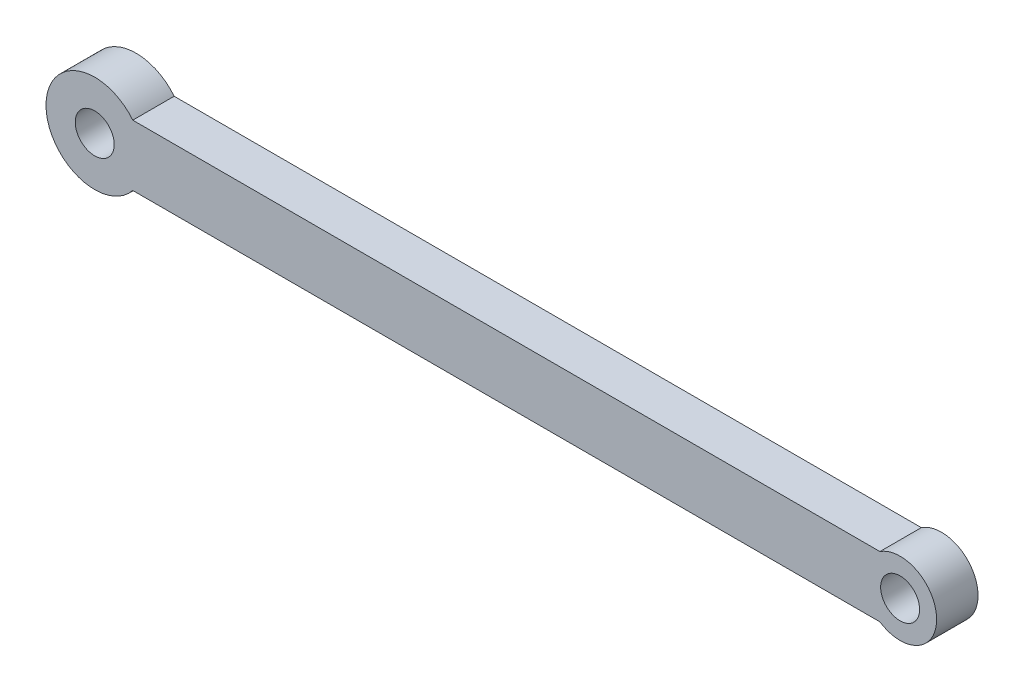
ISO-10303-21;
HEADER;
FILE_DESCRIPTION(('STEP AP214'),'2;1');
FILE_NAME('part.step','',(''),(''),'','','');
FILE_SCHEMA(('AUTOMOTIVE_DESIGN { 1 0 10303 214 1 1 1 1 }'));
ENDSEC;
DATA;
#1=APPLICATION_CONTEXT('core data for automotive mechanical design processes');
#2=APPLICATION_PROTOCOL_DEFINITION('international standard','automotive_design',2000,#1);
#3=PRODUCT_CONTEXT('',#1,'mechanical');
#4=PRODUCT('Part','Part','',(#3));
#5=PRODUCT_RELATED_PRODUCT_CATEGORY('part','',(#4));
#6=PRODUCT_DEFINITION_FORMATION('','',#4);
#7=PRODUCT_DEFINITION_CONTEXT('part definition',#1,'design');
#8=PRODUCT_DEFINITION('design','',#6,#7);
#9=PRODUCT_DEFINITION_SHAPE('','',#8);
#10=(LENGTH_UNIT() NAMED_UNIT(*) SI_UNIT(.MILLI.,.METRE.));
#11=(NAMED_UNIT(*) PLANE_ANGLE_UNIT() SI_UNIT($,.RADIAN.));
#12=(NAMED_UNIT(*) SI_UNIT($,.STERADIAN.) SOLID_ANGLE_UNIT());
#13=UNCERTAINTY_MEASURE_WITH_UNIT(LENGTH_MEASURE(1.E-05),#10,'distance_accuracy_value','');
#14=(GEOMETRIC_REPRESENTATION_CONTEXT(3) GLOBAL_UNCERTAINTY_ASSIGNED_CONTEXT((#13)) GLOBAL_UNIT_ASSIGNED_CONTEXT((#10,
#11,#12)) REPRESENTATION_CONTEXT('',''));
#15=CARTESIAN_POINT('',(0.,0.,0.));
#16=DIRECTION('',(0.,0.,1.));
#17=DIRECTION('',(1.,0.,0.));
#18=AXIS2_PLACEMENT_3D('',#15,#16,#17);
#19=CARTESIAN_POINT('',(0.,0.,3.4));
#20=DIRECTION('',(0.,0.,-1.));
#21=DIRECTION('',(-1.,0.,0.));
#22=AXIS2_PLACEMENT_3D('',#19,#20,#21);
#23=PLANE('',#22);
#24=CARTESIAN_POINT('',(0.,0.,3.4));
#25=DIRECTION('',(0.,0.,1.));
#26=DIRECTION('',(-1.,0.,0.));
#27=AXIS2_PLACEMENT_3D('',#24,#25,#26);
#28=CIRCLE('',#27,4.);
#29=CARTESIAN_POINT('',(3.1224989991992,2.5,3.4));
#30=VERTEX_POINT('',#29);
#31=CARTESIAN_POINT('',(3.1224989991992,-2.5,3.4));
#32=VERTEX_POINT('',#31);
#33=EDGE_CURVE('E85',#30,#32,#28,.T.);
#34=ORIENTED_EDGE('',*,*,#33,.T.);
#35=DIRECTION('',(1.,0.,0.));
#36=VECTOR('',#35,1.);
#37=CARTESIAN_POINT('',(3.1224989991992,-2.5,3.4));
#38=LINE('',#37,#36);
#39=CARTESIAN_POINT('',(64.4616876048223,-2.5,3.4));
#40=VERTEX_POINT('',#39);
#41=EDGE_CURVE('E80',#32,#40,#38,.T.);
#42=ORIENTED_EDGE('',*,*,#41,.T.);
#43=CARTESIAN_POINT('',(66.12,0.,3.4));
#44=DIRECTION('',(0.,0.,1.));
#45=DIRECTION('',(-1.,0.,0.));
#46=AXIS2_PLACEMENT_3D('',#43,#44,#45);
#47=CIRCLE('',#46,3.);
#48=CARTESIAN_POINT('',(64.4616876048223,2.5,3.4));
#49=VERTEX_POINT('',#48);
#50=EDGE_CURVE('E83',#40,#49,#47,.T.);
#51=ORIENTED_EDGE('',*,*,#50,.T.);
#52=DIRECTION('',(-1.,0.,0.));
#53=VECTOR('',#52,1.);
#54=CARTESIAN_POINT('',(3.1224989991992,2.5,3.4));
#55=LINE('',#54,#53);
#56=EDGE_CURVE('E50',#49,#30,#55,.T.);
#57=ORIENTED_EDGE('',*,*,#56,.T.);
#58=EDGE_LOOP('',(#34,#42,#51,#57));
#59=FACE_BOUND('',#58,.T.);
#60=CARTESIAN_POINT('',(0.,0.,3.4));
#61=DIRECTION('',(0.,0.,1.));
#62=DIRECTION('',(1.,0.,0.));
#63=AXIS2_PLACEMENT_3D('',#60,#61,#62);
#64=CIRCLE('',#63,1.6);
#65=CARTESIAN_POINT('',(1.6,0.,3.4));
#66=VERTEX_POINT('',#65);
#67=EDGE_CURVE('E100',#66,#66,#64,.T.);
#68=ORIENTED_EDGE('',*,*,#67,.F.);
#69=EDGE_LOOP('',(#68));
#70=FACE_BOUND('',#69,.T.);
#71=CARTESIAN_POINT('',(66.12,0.,3.4));
#72=DIRECTION('',(0.,0.,1.));
#73=DIRECTION('',(1.,0.,0.));
#74=AXIS2_PLACEMENT_3D('',#71,#72,#73);
#75=CIRCLE('',#74,1.60000000000001);
#76=CARTESIAN_POINT('',(67.72,0.,3.4));
#77=VERTEX_POINT('',#76);
#78=EDGE_CURVE('E115',#77,#77,#75,.T.);
#79=ORIENTED_EDGE('',*,*,#78,.F.);
#80=EDGE_LOOP('',(#79));
#81=FACE_BOUND('',#80,.T.);
#82=ADVANCED_FACE('F33',(#59,#70,#81),#23,.F.);
#83=CARTESIAN_POINT('',(0.,0.,0.));
#84=DIRECTION('',(0.,0.,-1.));
#85=DIRECTION('',(-1.,0.,0.));
#86=AXIS2_PLACEMENT_3D('',#83,#84,#85);
#87=PLANE('',#86);
#88=CARTESIAN_POINT('',(0.,0.,0.));
#89=DIRECTION('',(0.,0.,1.));
#90=DIRECTION('',(1.,0.,0.));
#91=AXIS2_PLACEMENT_3D('',#88,#89,#90);
#92=CIRCLE('',#91,1.6);
#93=CARTESIAN_POINT('',(1.6,0.,0.));
#94=VERTEX_POINT('',#93);
#95=EDGE_CURVE('E112',#94,#94,#92,.T.);
#96=ORIENTED_EDGE('',*,*,#95,.T.);
#97=EDGE_LOOP('',(#96));
#98=FACE_BOUND('',#97,.T.);
#99=CARTESIAN_POINT('',(0.,0.,0.));
#100=DIRECTION('',(0.,0.,1.));
#101=DIRECTION('',(-1.,0.,0.));
#102=AXIS2_PLACEMENT_3D('',#99,#100,#101);
#103=CIRCLE('',#102,4.);
#104=CARTESIAN_POINT('',(3.1224989991992,2.5,0.));
#105=VERTEX_POINT('',#104);
#106=CARTESIAN_POINT('',(3.1224989991992,-2.5,0.));
#107=VERTEX_POINT('',#106);
#108=EDGE_CURVE('E97',#105,#107,#103,.T.);
#109=ORIENTED_EDGE('',*,*,#108,.F.);
#110=DIRECTION('',(-1.,0.,0.));
#111=VECTOR('',#110,1.);
#112=CARTESIAN_POINT('',(3.1224989991992,2.5,0.));
#113=LINE('',#112,#111);
#114=CARTESIAN_POINT('',(64.4616876048223,2.5,0.));
#115=VERTEX_POINT('',#114);
#116=EDGE_CURVE('E73',#115,#105,#113,.T.);
#117=ORIENTED_EDGE('',*,*,#116,.F.);
#118=CARTESIAN_POINT('',(66.12,0.,0.));
#119=DIRECTION('',(0.,0.,1.));
#120=DIRECTION('',(-1.,0.,0.));
#121=AXIS2_PLACEMENT_3D('',#118,#119,#120);
#122=CIRCLE('',#121,3.);
#123=CARTESIAN_POINT('',(64.4616876048223,-2.5,0.));
#124=VERTEX_POINT('',#123);
#125=EDGE_CURVE('E67',#124,#115,#122,.T.);
#126=ORIENTED_EDGE('',*,*,#125,.F.);
#127=DIRECTION('',(1.,0.,0.));
#128=VECTOR('',#127,1.);
#129=CARTESIAN_POINT('',(3.1224989991992,-2.5,0.));
#130=LINE('',#129,#128);
#131=EDGE_CURVE('E89',#107,#124,#130,.T.);
#132=ORIENTED_EDGE('',*,*,#131,.F.);
#133=EDGE_LOOP('',(#109,#117,#126,#132));
#134=FACE_BOUND('',#133,.T.);
#135=CARTESIAN_POINT('',(66.12,0.,0.));
#136=DIRECTION('',(0.,0.,1.));
#137=DIRECTION('',(1.,0.,0.));
#138=AXIS2_PLACEMENT_3D('',#135,#136,#137);
#139=CIRCLE('',#138,1.60000000000001);
#140=CARTESIAN_POINT('',(67.72,0.,0.));
#141=VERTEX_POINT('',#140);
#142=EDGE_CURVE('E118',#141,#141,#139,.T.);
#143=ORIENTED_EDGE('',*,*,#142,.T.);
#144=EDGE_LOOP('',(#143));
#145=FACE_BOUND('',#144,.T.);
#146=ADVANCED_FACE('F108',(#98,#134,#145),#87,.T.);
#147=CARTESIAN_POINT('',(0.,0.,3.4));
#148=DIRECTION('',(0.,0.,-1.));
#149=DIRECTION('',(-1.,0.,0.));
#150=AXIS2_PLACEMENT_3D('',#147,#148,#149);
#151=CYLINDRICAL_SURFACE('',#150,4.);
#152=ORIENTED_EDGE('',*,*,#108,.T.);
#153=DIRECTION('',(0.,0.,-1.));
#154=VECTOR('',#153,1.);
#155=CARTESIAN_POINT('',(3.1224989991992,-2.5,3.4));
#156=LINE('',#155,#154);
#157=EDGE_CURVE('E11',#32,#107,#156,.T.);
#158=ORIENTED_EDGE('',*,*,#157,.F.);
#159=ORIENTED_EDGE('',*,*,#33,.F.);
#160=DIRECTION('',(0.,0.,-1.));
#161=VECTOR('',#160,1.);
#162=CARTESIAN_POINT('',(3.1224989991992,2.5,3.4));
#163=LINE('',#162,#161);
#164=EDGE_CURVE('E93',#30,#105,#163,.T.);
#165=ORIENTED_EDGE('',*,*,#164,.T.);
#166=EDGE_LOOP('',(#152,#158,#159,#165));
#167=FACE_BOUND('',#166,.T.);
#168=ADVANCED_FACE('F35',(#167),#151,.T.);
#169=CARTESIAN_POINT('',(3.1224989991992,-2.5,3.4));
#170=DIRECTION('',(0.,1.,0.));
#171=DIRECTION('',(0.,0.,1.));
#172=AXIS2_PLACEMENT_3D('',#169,#170,#171);
#173=PLANE('',#172);
#174=ORIENTED_EDGE('',*,*,#131,.T.);
#175=DIRECTION('',(0.,0.,-1.));
#176=VECTOR('',#175,1.);
#177=CARTESIAN_POINT('',(64.4616876048223,-2.5,3.4));
#178=LINE('',#177,#176);
#179=EDGE_CURVE('E42',#40,#124,#178,.T.);
#180=ORIENTED_EDGE('',*,*,#179,.F.);
#181=ORIENTED_EDGE('',*,*,#41,.F.);
#182=ORIENTED_EDGE('',*,*,#157,.T.);
#183=EDGE_LOOP('',(#174,#180,#181,#182));
#184=FACE_BOUND('',#183,.T.);
#185=ADVANCED_FACE('F88',(#184),#173,.F.);
#186=CARTESIAN_POINT('',(66.12,0.,3.4));
#187=DIRECTION('',(0.,0.,-1.));
#188=DIRECTION('',(-1.,0.,0.));
#189=AXIS2_PLACEMENT_3D('',#186,#187,#188);
#190=CYLINDRICAL_SURFACE('',#189,3.);
#191=ORIENTED_EDGE('',*,*,#125,.T.);
#192=DIRECTION('',(0.,0.,-1.));
#193=VECTOR('',#192,1.);
#194=CARTESIAN_POINT('',(64.4616876048223,2.5,3.4));
#195=LINE('',#194,#193);
#196=EDGE_CURVE('E90',#49,#115,#195,.T.);
#197=ORIENTED_EDGE('',*,*,#196,.F.);
#198=ORIENTED_EDGE('',*,*,#50,.F.);
#199=ORIENTED_EDGE('',*,*,#179,.T.);
#200=EDGE_LOOP('',(#191,#197,#198,#199));
#201=FACE_BOUND('',#200,.T.);
#202=ADVANCED_FACE('F91',(#201),#190,.T.);
#203=CARTESIAN_POINT('',(3.1224989991992,2.5,3.4));
#204=DIRECTION('',(0.,-1.,0.));
#205=DIRECTION('',(0.,0.,-1.));
#206=AXIS2_PLACEMENT_3D('',#203,#204,#205);
#207=PLANE('',#206);
#208=ORIENTED_EDGE('',*,*,#116,.T.);
#209=ORIENTED_EDGE('',*,*,#164,.F.);
#210=ORIENTED_EDGE('',*,*,#56,.F.);
#211=ORIENTED_EDGE('',*,*,#196,.T.);
#212=EDGE_LOOP('',(#208,#209,#210,#211));
#213=FACE_BOUND('',#212,.T.);
#214=ADVANCED_FACE('F105',(#213),#207,.F.);
#215=CARTESIAN_POINT('',(0.,0.,3.4));
#216=DIRECTION('',(0.,0.,-1.));
#217=DIRECTION('',(-1.,0.,0.));
#218=AXIS2_PLACEMENT_3D('',#215,#216,#217);
#219=CYLINDRICAL_SURFACE('',#218,1.6);
#220=ORIENTED_EDGE('',*,*,#67,.T.);
#221=EDGE_LOOP('',(#220));
#222=FACE_BOUND('',#221,.T.);
#223=ORIENTED_EDGE('',*,*,#95,.F.);
#224=EDGE_LOOP('',(#223));
#225=FACE_BOUND('',#224,.T.);
#226=ADVANCED_FACE('F135',(#222,#225),#219,.F.);
#227=CARTESIAN_POINT('',(66.12,0.,3.4));
#228=DIRECTION('',(0.,0.,-1.));
#229=DIRECTION('',(-1.,0.,0.));
#230=AXIS2_PLACEMENT_3D('',#227,#228,#229);
#231=CYLINDRICAL_SURFACE('',#230,1.60000000000001);
#232=ORIENTED_EDGE('',*,*,#78,.T.);
#233=EDGE_LOOP('',(#232));
#234=FACE_BOUND('',#233,.T.);
#235=ORIENTED_EDGE('',*,*,#142,.F.);
#236=EDGE_LOOP('',(#235));
#237=FACE_BOUND('',#236,.T.);
#238=ADVANCED_FACE('F124',(#234,#237),#231,.F.);
#239=CLOSED_SHELL('',(#82,#146,#168,#185,#202,#214,#226,#238));
#240=MANIFOLD_SOLID_BREP('B2',#239);
#241=ADVANCED_BREP_SHAPE_REPRESENTATION('',(#18,#240),#14);
#242=SHAPE_DEFINITION_REPRESENTATION(#9,#241);
ENDSEC;
END-ISO-10303-21;
